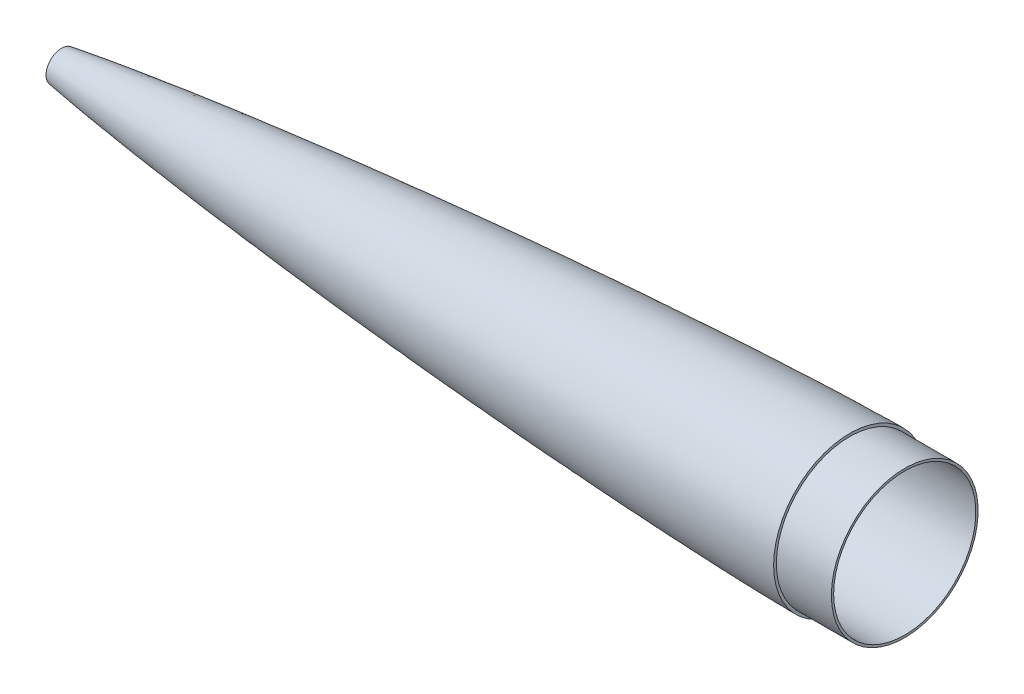
ISO-10303-21;
HEADER;
FILE_DESCRIPTION(('STEP AP214'),'2;1');
FILE_NAME('part.step','',(''),(''),'','','');
FILE_SCHEMA(('AUTOMOTIVE_DESIGN { 1 0 10303 214 1 1 1 1 }'));
ENDSEC;
DATA;
#1=APPLICATION_CONTEXT('core data for automotive mechanical design processes');
#2=APPLICATION_PROTOCOL_DEFINITION('international standard','automotive_design',2000,#1);
#3=PRODUCT_CONTEXT('',#1,'mechanical');
#4=PRODUCT('Part','Part','',(#3));
#5=PRODUCT_RELATED_PRODUCT_CATEGORY('part','',(#4));
#6=PRODUCT_DEFINITION_FORMATION('','',#4);
#7=PRODUCT_DEFINITION_CONTEXT('part definition',#1,'design');
#8=PRODUCT_DEFINITION('design','',#6,#7);
#9=PRODUCT_DEFINITION_SHAPE('','',#8);
#10=(LENGTH_UNIT() NAMED_UNIT(*) SI_UNIT(.MILLI.,.METRE.));
#11=(NAMED_UNIT(*) PLANE_ANGLE_UNIT() SI_UNIT($,.RADIAN.));
#12=(NAMED_UNIT(*) SI_UNIT($,.STERADIAN.) SOLID_ANGLE_UNIT());
#13=UNCERTAINTY_MEASURE_WITH_UNIT(LENGTH_MEASURE(1.E-05),#10,'distance_accuracy_value','');
#14=(GEOMETRIC_REPRESENTATION_CONTEXT(3) GLOBAL_UNCERTAINTY_ASSIGNED_CONTEXT((#13)) GLOBAL_UNIT_ASSIGNED_CONTEXT((#10,
#11,#12)) REPRESENTATION_CONTEXT('',''));
#15=CARTESIAN_POINT('',(0.,0.,0.));
#16=DIRECTION('',(0.,0.,1.));
#17=DIRECTION('',(1.,0.,0.));
#18=AXIS2_PLACEMENT_3D('',#15,#16,#17);
#19=CARTESIAN_POINT('',(596.9,52.74818,0.));
#20=CARTESIAN_POINT('',(594.981085772942,52.7439766182815,0.));
#21=CARTESIAN_POINT('',(591.143361642924,52.7119561177822,0.));
#22=CARTESIAN_POINT('',(583.468325071776,52.6115940478195,0.));
#23=CARTESIAN_POINT('',(571.206307330957,52.3702922496184,0.));
#24=CARTESIAN_POINT('',(556.277134536275,51.9856247831863,0.));
#25=CARTESIAN_POINT('',(534.095751609961,51.2822622218943,0.));
#26=CARTESIAN_POINT('',(506.5841207546,50.2205319325961,0.));
#27=CARTESIAN_POINT('',(474.496680759096,48.7563639094325,0.));
#28=CARTESIAN_POINT('',(437.838411885817,46.818732197122,0.));
#29=CARTESIAN_POINT('',(401.193599470544,44.6420572267023,0.));
#30=CARTESIAN_POINT('',(364.562894607915,42.2399567576188,0.));
#31=CARTESIAN_POINT('',(327.947239610889,39.618425854242,0.));
#32=CARTESIAN_POINT('',(291.348007401785,36.7768124514222,0.));
#33=CARTESIAN_POINT('',(254.767048184149,33.7085063186159,0.));
#34=CARTESIAN_POINT('',(218.207080059752,30.3992455850085,0.));
#35=CARTESIAN_POINT('',(181.67186265107,26.8260098654848,0.));
#36=CARTESIAN_POINT('',(145.167419267207,22.9502479118758,0.));
#37=CARTESIAN_POINT('',(108.703042074813,18.711081158448,0.));
#38=CARTESIAN_POINT('',(75.561592020845,14.4184193653755,0.));
#39=CARTESIAN_POINT('',(48.0380921073077,10.3790406790519,0.));
#40=CARTESIAN_POINT('',(27.782103231772,6.92717758336565,0.));
#41=CARTESIAN_POINT('',(15.6155281201881,4.51233854333897,0.));
#42=CARTESIAN_POINT('',(8.71933118048638,2.91617819387342,0.));
#43=CARTESIAN_POINT('',(5.02966537861984,1.92884340558088,0.));
#44=CARTESIAN_POINT('',(3.02858814726836,1.31676153051974,0.));
#45=CARTESIAN_POINT('',(1.91317692998907,0.93176035109636,0.));
#46=CARTESIAN_POINT('',(1.29300271208459,0.693253150144167,0.));
#47=CARTESIAN_POINT('',(0.932165851339865,0.541497874129996,0.));
#48=CARTESIAN_POINT('',(0.699728382330023,0.436250009913596,0.));
#49=CARTESIAN_POINT('',(0.539072772842008,0.359186242832004,0.));
#50=CARTESIAN_POINT('',(0.399119277455206,0.287038857933432,0.));
#51=CARTESIAN_POINT('',(0.279818282563663,0.220197585336474,0.));
#52=CARTESIAN_POINT('',(0.180428525159842,0.158737146182066,0.));
#53=CARTESIAN_POINT('',(0.110473241421188,0.110595859922417,0.));
#54=CARTESIAN_POINT('',(0.0582878402621543,0.0690247542532056,0.));
#55=CARTESIAN_POINT('',(0.023331290383149,0.0352525733814115,0.));
#56=CARTESIAN_POINT('',(0.00804574966633972,0.0163261743468633,0.));
#57=CARTESIAN_POINT('',(0.00237693213132801,0.00563433549737124,0.));
#58=CARTESIAN_POINT('',(0.,0.,0.));
#59=B_SPLINE_CURVE_WITH_KNOTS('',4,(#19,#20,#21,#22,#23,#24,#25,#26,#27,#28,#29,#30,#31,#32,#33,
#34,#35,#36,#37,#38,#39,#40,#41,#42,#43,#44,#45,#46,#47,#48,#49,#50,#51,#52,#53,#54,#55,#56,#57,
#58),.UNSPECIFIED.,.F.,.F.,(5,1,1,1,1,1,1,1,1,1,1,1,1,1,1,1,1,1,1,1,1,1,1,1,1,1,1,1,1,1,1,1,1,1,
1,1,5),(0.,0.0127915006460431,0.0255830012920861,0.0511660025841724,0.0817539552175705,
0.112341907850969,0.173517813554601,0.234693719179658,0.295869624144422,0.357045529383124,
0.418221434840136,0.479397340471153,0.54057324623338,0.601749151591606,0.662925056674679,
0.724100961894715,0.785276867533579,0.846452772012617,0.907628670550915,0.946859777235718,
0.970700652554181,0.983412262477229,0.990301731317356,0.994037247427691,0.996156512029755,
0.997358787258242,0.99816596334814,0.998465742833605,0.99876552231907,0.99905955597412,
0.99935358962917,0.999515192221878,0.999676794814585,0.999838397407293,0.999919198703646,
0.999959599351823,1.),.UNSPECIFIED.);
#60=CARTESIAN_POINT('',(0.,0.,0.));
#61=DIRECTION('',(-1.,0.,0.));
#62=AXIS1_PLACEMENT('',#60,#61);
#63=SURFACE_OF_REVOLUTION('',#59,#62);
#64=CARTESIAN_POINT('',(50.8000000000001,0.,0.));
#65=DIRECTION('',(-1.,0.,0.));
#66=DIRECTION('',(0.,0.,1.));
#67=AXIS2_PLACEMENT_3D('',#64,#65,#66);
#68=CIRCLE('',#67,10.6878333302251);
#69=CARTESIAN_POINT('',(50.8000000000001,0.,10.6878333302251));
#70=VERTEX_POINT('',#69);
#71=EDGE_CURVE('E95',#70,#70,#68,.F.);
#72=ORIENTED_EDGE('',*,*,#71,.T.);
#73=EDGE_LOOP('',(#72));
#74=FACE_BOUND('',#73,.T.);
#75=CARTESIAN_POINT('',(596.9,0.,0.));
#76=DIRECTION('',(-1.,0.,0.));
#77=DIRECTION('',(0.,0.,1.));
#78=AXIS2_PLACEMENT_3D('',#75,#76,#77);
#79=CIRCLE('',#78,52.74818);
#80=CARTESIAN_POINT('',(596.9,0.,52.74818));
#81=VERTEX_POINT('',#80);
#82=EDGE_CURVE('E10',#81,#81,#79,.T.);
#83=ORIENTED_EDGE('',*,*,#82,.T.);
#84=EDGE_LOOP('',(#83));
#85=FACE_BOUND('',#84,.T.);
#86=ADVANCED_FACE('F34',(#74,#85),#63,.T.);
#87=CARTESIAN_POINT('',(596.9,0.,0.));
#88=DIRECTION('',(-1.,0.,0.));
#89=DIRECTION('',(0.,0.,1.));
#90=AXIS2_PLACEMENT_3D('',#87,#88,#89);
#91=PLANE('',#90);
#92=CARTESIAN_POINT('',(596.9,0.,0.));
#93=DIRECTION('',(-1.,0.,0.));
#94=DIRECTION('',(0.,0.,1.));
#95=AXIS2_PLACEMENT_3D('',#92,#93,#94);
#96=CIRCLE('',#95,50.8380953963041);
#97=CARTESIAN_POINT('',(596.9,0.,50.8380953963041));
#98=VERTEX_POINT('',#97);
#99=EDGE_CURVE('E42',#98,#98,#96,.F.);
#100=ORIENTED_EDGE('',*,*,#99,.F.);
#101=EDGE_LOOP('',(#100));
#102=FACE_BOUND('',#101,.T.);
#103=ORIENTED_EDGE('',*,*,#82,.F.);
#104=EDGE_LOOP('',(#103));
#105=FACE_BOUND('',#104,.T.);
#106=ADVANCED_FACE('F77',(#102,#105),#91,.F.);
#107=CARTESIAN_POINT('',(635.,0.,0.));
#108=DIRECTION('',(-1.,0.,0.));
#109=DIRECTION('',(0.,0.,1.));
#110=AXIS2_PLACEMENT_3D('',#107,#108,#109);
#111=CYLINDRICAL_SURFACE('',#110,50.8380953963041);
#112=CARTESIAN_POINT('',(635.,0.,0.));
#113=DIRECTION('',(1.,0.,0.));
#114=DIRECTION('',(0.,0.,-1.));
#115=AXIS2_PLACEMENT_3D('',#112,#113,#114);
#116=CIRCLE('',#115,50.8380953963041);
#117=CARTESIAN_POINT('',(635.,0.,50.8380953963041));
#118=VERTEX_POINT('',#117);
#119=EDGE_CURVE('E54',#118,#118,#116,.T.);
#120=CARTESIAN_POINT('',(635.,0.,50.8380953963041));
#121=CARTESIAN_POINT('',(634.603125,0.,50.8380953963041));
#122=CARTESIAN_POINT('',(634.20625,0.,50.8380953963041));
#123=CARTESIAN_POINT('',(633.4125,0.,50.8380953963041));
#124=CARTESIAN_POINT('',(633.015625,0.,50.8380953963041));
#125=CARTESIAN_POINT('',(632.221875,0.,50.8380953963041));
#126=CARTESIAN_POINT('',(631.825,0.,50.8380953963041));
#127=CARTESIAN_POINT('',(631.03125,0.,50.8380953963041));
#128=CARTESIAN_POINT('',(630.634375,0.,50.8380953963041));
#129=CARTESIAN_POINT('',(629.840625,0.,50.8380953963041));
#130=CARTESIAN_POINT('',(629.44375,0.,50.8380953963041));
#131=CARTESIAN_POINT('',(628.65,0.,50.8380953963041));
#132=CARTESIAN_POINT('',(628.253125,0.,50.8380953963041));
#133=CARTESIAN_POINT('',(627.459375,0.,50.8380953963041));
#134=CARTESIAN_POINT('',(627.0625,0.,50.8380953963041));
#135=CARTESIAN_POINT('',(626.26875,0.,50.8380953963041));
#136=CARTESIAN_POINT('',(625.871875,0.,50.8380953963041));
#137=CARTESIAN_POINT('',(625.078125,0.,50.8380953963041));
#138=CARTESIAN_POINT('',(624.68125,0.,50.8380953963041));
#139=CARTESIAN_POINT('',(623.8875,0.,50.8380953963041));
#140=CARTESIAN_POINT('',(623.490625,0.,50.8380953963041));
#141=CARTESIAN_POINT('',(622.696875,0.,50.8380953963041));
#142=CARTESIAN_POINT('',(622.3,0.,50.8380953963041));
#143=CARTESIAN_POINT('',(621.50625,0.,50.8380953963041));
#144=CARTESIAN_POINT('',(621.109375,0.,50.8380953963041));
#145=CARTESIAN_POINT('',(620.315625,0.,50.8380953963041));
#146=CARTESIAN_POINT('',(619.91875,0.,50.8380953963041));
#147=CARTESIAN_POINT('',(619.125,0.,50.8380953963041));
#148=CARTESIAN_POINT('',(618.728125,0.,50.8380953963041));
#149=CARTESIAN_POINT('',(617.934375,0.,50.8380953963041));
#150=CARTESIAN_POINT('',(617.5375,0.,50.8380953963041));
#151=CARTESIAN_POINT('',(616.74375,0.,50.8380953963041));
#152=CARTESIAN_POINT('',(616.346875,0.,50.8380953963041));
#153=CARTESIAN_POINT('',(615.553125,0.,50.8380953963041));
#154=CARTESIAN_POINT('',(615.15625,0.,50.8380953963041));
#155=CARTESIAN_POINT('',(614.3625,0.,50.8380953963041));
#156=CARTESIAN_POINT('',(613.965625,0.,50.8380953963041));
#157=CARTESIAN_POINT('',(613.171875,0.,50.8380953963041));
#158=CARTESIAN_POINT('',(612.775,0.,50.8380953963041));
#159=CARTESIAN_POINT('',(611.98125,0.,50.8380953963041));
#160=CARTESIAN_POINT('',(611.584375,0.,50.8380953963041));
#161=CARTESIAN_POINT('',(610.790625,0.,50.8380953963041));
#162=CARTESIAN_POINT('',(610.39375,0.,50.8380953963041));
#163=CARTESIAN_POINT('',(609.6,0.,50.8380953963041));
#164=CARTESIAN_POINT('',(609.203125,0.,50.8380953963041));
#165=CARTESIAN_POINT('',(608.409375,0.,50.8380953963041));
#166=CARTESIAN_POINT('',(608.0125,0.,50.8380953963041));
#167=CARTESIAN_POINT('',(607.21875,0.,50.8380953963041));
#168=CARTESIAN_POINT('',(606.821875,0.,50.8380953963041));
#169=CARTESIAN_POINT('',(606.028125,0.,50.8380953963041));
#170=CARTESIAN_POINT('',(605.63125,0.,50.8380953963041));
#171=CARTESIAN_POINT('',(604.8375,0.,50.8380953963041));
#172=CARTESIAN_POINT('',(604.440625,0.,50.8380953963041));
#173=CARTESIAN_POINT('',(603.646875,0.,50.8380953963041));
#174=CARTESIAN_POINT('',(603.25,0.,50.8380953963041));
#175=CARTESIAN_POINT('',(602.45625,0.,50.8380953963041));
#176=CARTESIAN_POINT('',(602.059375,0.,50.8380953963041));
#177=CARTESIAN_POINT('',(601.265625,0.,50.8380953963041));
#178=CARTESIAN_POINT('',(600.86875,0.,50.8380953963041));
#179=CARTESIAN_POINT('',(600.075,0.,50.8380953963041));
#180=CARTESIAN_POINT('',(599.678125,0.,50.8380953963041));
#181=CARTESIAN_POINT('',(598.884375,0.,50.8380953963041));
#182=CARTESIAN_POINT('',(598.4875,0.,50.8380953963041));
#183=CARTESIAN_POINT('',(597.69375,0.,50.8380953963041));
#184=CARTESIAN_POINT('',(597.296875,0.,50.8380953963041));
#185=CARTESIAN_POINT('',(596.9,0.,50.8380953963041));
#186=B_SPLINE_CURVE_WITH_KNOTS('',3,(#120,#121,#122,#123,#124,#125,#126,#127,#128,#129,#130,
#131,#132,#133,#134,#135,#136,#137,#138,#139,#140,#141,#142,#143,#144,#145,#146,#147,#148,#149,
#150,#151,#152,#153,#154,#155,#156,#157,#158,#159,#160,#161,#162,#163,#164,#165,#166,#167,#168,
#169,#170,#171,#172,#173,#174,#175,#176,#177,#178,#179,#180,#181,#182,#183,#184,#185),
.UNSPECIFIED.,.F.,.F.,(4,2,2,2,2,2,2,2,2,2,2,2,2,2,2,2,2,2,2,2,2,2,2,2,2,2,2,2,2,2,2,2,4),(0.,
1.19062499999989,2.38124999999989,3.57187499999989,4.76249999999989,5.95312499999989,
7.14374999999989,8.33437499999989,9.5249999999999,10.7156249999999,11.9062499999999,
13.0968749999999,14.2874999999999,15.4781249999999,16.6687499999999,17.8593749999999,
19.0499999999999,20.2406249999999,21.4312499999999,22.6218749999999,23.8124999999999,
25.0031249999999,26.1937499999999,27.3843749999999,28.5749999999999,29.7656249999999,
30.9562499999999,32.1468749999999,33.3374999999999,34.5281249999999,35.7187499999999,
36.9093749999998,38.0999999999998),.UNSPECIFIED.);
#187=EDGE_CURVE('BSEAM79',#118,#98,#186,.T.);
#188=ORIENTED_EDGE('',*,*,#119,.F.);
#189=ORIENTED_EDGE('',*,*,#99,.T.);
#190=ORIENTED_EDGE('',*,*,#187,.T.);
#191=ORIENTED_EDGE('',*,*,#187,.F.);
#192=EDGE_LOOP('',(#188,#190,#189,#191));
#193=FACE_BOUND('',#192,.T.);
#194=ADVANCED_FACE('F79',(#193),#111,.T.);
#195=CARTESIAN_POINT('',(558.8,0.,0.));
#196=DIRECTION('',(1.,0.,0.));
#197=DIRECTION('',(0.,0.,-1.));
#198=AXIS2_PLACEMENT_3D('',#195,#196,#197);
#199=PLANE('',#198);
#200=CARTESIAN_POINT('',(558.8,0.,0.));
#201=DIRECTION('',(1.,0.,0.));
#202=DIRECTION('',(0.,0.,-1.));
#203=AXIS2_PLACEMENT_3D('',#200,#201,#202);
#204=CIRCLE('',#203,49.2505953963041);
#205=CARTESIAN_POINT('',(558.8,0.,49.2505953963041));
#206=VERTEX_POINT('',#205);
#207=EDGE_CURVE('E63',#206,#206,#204,.T.);
#208=ORIENTED_EDGE('',*,*,#207,.T.);
#209=EDGE_LOOP('',(#208));
#210=FACE_BOUND('',#209,.T.);
#211=CARTESIAN_POINT('',(558.8,0.,0.));
#212=DIRECTION('',(-1.,0.,0.));
#213=DIRECTION('',(0.,0.,1.));
#214=AXIS2_PLACEMENT_3D('',#211,#212,#213);
#215=CIRCLE('',#214,50.1244954155033);
#216=CARTESIAN_POINT('',(558.8,0.,50.1244954155033));
#217=VERTEX_POINT('',#216);
#218=EDGE_CURVE('E47',#217,#217,#215,.F.);
#219=ORIENTED_EDGE('',*,*,#218,.F.);
#220=EDGE_LOOP('',(#219));
#221=FACE_BOUND('',#220,.T.);
#222=ADVANCED_FACE('F85',(#210,#221),#199,.F.);
#223=CARTESIAN_POINT('',(635.,0.,0.));
#224=DIRECTION('',(1.,0.,0.));
#225=DIRECTION('',(0.,0.,-1.));
#226=AXIS2_PLACEMENT_3D('',#223,#224,#225);
#227=PLANE('',#226);
#228=ORIENTED_EDGE('',*,*,#119,.T.);
#229=EDGE_LOOP('',(#228));
#230=FACE_BOUND('',#229,.T.);
#231=CARTESIAN_POINT('',(635.,0.,0.));
#232=DIRECTION('',(1.,0.,0.));
#233=DIRECTION('',(0.,0.,-1.));
#234=AXIS2_PLACEMENT_3D('',#231,#232,#233);
#235=CIRCLE('',#234,49.2505953963041);
#236=CARTESIAN_POINT('',(635.,0.,49.2505953963041));
#237=VERTEX_POINT('',#236);
#238=EDGE_CURVE('E58',#237,#237,#235,.T.);
#239=ORIENTED_EDGE('',*,*,#238,.F.);
#240=EDGE_LOOP('',(#239));
#241=FACE_BOUND('',#240,.T.);
#242=ADVANCED_FACE('F111',(#230,#241),#227,.T.);
#243=CARTESIAN_POINT('',(635.,0.,0.));
#244=DIRECTION('',(-1.,0.,0.));
#245=DIRECTION('',(0.,0.,1.));
#246=AXIS2_PLACEMENT_3D('',#243,#244,#245);
#247=CYLINDRICAL_SURFACE('',#246,49.2505953963041);
#248=CARTESIAN_POINT('',(635.,0.,49.2505953963041));
#249=CARTESIAN_POINT('',(634.20625,0.,49.2505953963041));
#250=CARTESIAN_POINT('',(633.4125,0.,49.2505953963041));
#251=CARTESIAN_POINT('',(631.825,0.,49.2505953963041));
#252=CARTESIAN_POINT('',(631.03125,0.,49.2505953963041));
#253=CARTESIAN_POINT('',(629.44375,0.,49.2505953963041));
#254=CARTESIAN_POINT('',(628.65,0.,49.2505953963041));
#255=CARTESIAN_POINT('',(627.0625,0.,49.2505953963041));
#256=CARTESIAN_POINT('',(626.26875,0.,49.2505953963041));
#257=CARTESIAN_POINT('',(624.68125,0.,49.2505953963041));
#258=CARTESIAN_POINT('',(623.8875,0.,49.2505953963041));
#259=CARTESIAN_POINT('',(622.3,0.,49.2505953963041));
#260=CARTESIAN_POINT('',(621.50625,0.,49.2505953963041));
#261=CARTESIAN_POINT('',(619.91875,0.,49.2505953963041));
#262=CARTESIAN_POINT('',(619.125,0.,49.2505953963041));
#263=CARTESIAN_POINT('',(617.5375,0.,49.2505953963041));
#264=CARTESIAN_POINT('',(616.74375,0.,49.2505953963041));
#265=CARTESIAN_POINT('',(615.15625,0.,49.2505953963041));
#266=CARTESIAN_POINT('',(614.3625,0.,49.2505953963041));
#267=CARTESIAN_POINT('',(612.775,0.,49.2505953963041));
#268=CARTESIAN_POINT('',(611.98125,0.,49.2505953963041));
#269=CARTESIAN_POINT('',(610.39375,0.,49.2505953963041));
#270=CARTESIAN_POINT('',(609.6,0.,49.2505953963041));
#271=CARTESIAN_POINT('',(608.0125,0.,49.2505953963041));
#272=CARTESIAN_POINT('',(607.21875,0.,49.2505953963041));
#273=CARTESIAN_POINT('',(605.63125,0.,49.2505953963041));
#274=CARTESIAN_POINT('',(604.8375,0.,49.2505953963041));
#275=CARTESIAN_POINT('',(603.25,0.,49.2505953963041));
#276=CARTESIAN_POINT('',(602.45625,0.,49.2505953963041));
#277=CARTESIAN_POINT('',(600.86875,0.,49.2505953963041));
#278=CARTESIAN_POINT('',(600.075,0.,49.2505953963041));
#279=CARTESIAN_POINT('',(598.4875,0.,49.2505953963041));
#280=CARTESIAN_POINT('',(597.69375,0.,49.2505953963041));
#281=CARTESIAN_POINT('',(596.10625,0.,49.2505953963041));
#282=CARTESIAN_POINT('',(595.3125,0.,49.2505953963041));
#283=CARTESIAN_POINT('',(593.725,0.,49.2505953963041));
#284=CARTESIAN_POINT('',(592.93125,0.,49.2505953963041));
#285=CARTESIAN_POINT('',(591.34375,0.,49.2505953963041));
#286=CARTESIAN_POINT('',(590.55,0.,49.2505953963041));
#287=CARTESIAN_POINT('',(588.9625,0.,49.2505953963041));
#288=CARTESIAN_POINT('',(588.16875,0.,49.2505953963041));
#289=CARTESIAN_POINT('',(586.58125,0.,49.2505953963041));
#290=CARTESIAN_POINT('',(585.7875,0.,49.2505953963041));
#291=CARTESIAN_POINT('',(584.2,0.,49.2505953963041));
#292=CARTESIAN_POINT('',(583.40625,0.,49.2505953963041));
#293=CARTESIAN_POINT('',(581.81875,0.,49.2505953963041));
#294=CARTESIAN_POINT('',(581.025,0.,49.2505953963041));
#295=CARTESIAN_POINT('',(579.4375,0.,49.2505953963041));
#296=CARTESIAN_POINT('',(578.64375,0.,49.2505953963041));
#297=CARTESIAN_POINT('',(577.05625,0.,49.2505953963041));
#298=CARTESIAN_POINT('',(576.2625,0.,49.2505953963041));
#299=CARTESIAN_POINT('',(574.675,0.,49.2505953963041));
#300=CARTESIAN_POINT('',(573.88125,0.,49.2505953963041));
#301=CARTESIAN_POINT('',(572.29375,0.,49.2505953963041));
#302=CARTESIAN_POINT('',(571.5,0.,49.2505953963041));
#303=CARTESIAN_POINT('',(569.9125,0.,49.2505953963041));
#304=CARTESIAN_POINT('',(569.11875,0.,49.2505953963041));
#305=CARTESIAN_POINT('',(567.53125,0.,49.2505953963041));
#306=CARTESIAN_POINT('',(566.7375,0.,49.2505953963041));
#307=CARTESIAN_POINT('',(565.15,0.,49.2505953963041));
#308=CARTESIAN_POINT('',(564.35625,0.,49.2505953963041));
#309=CARTESIAN_POINT('',(562.76875,0.,49.2505953963041));
#310=CARTESIAN_POINT('',(561.975,0.,49.2505953963041));
#311=CARTESIAN_POINT('',(560.3875,0.,49.2505953963041));
#312=CARTESIAN_POINT('',(559.59375,0.,49.2505953963041));
#313=CARTESIAN_POINT('',(558.8,0.,49.2505953963041));
#314=B_SPLINE_CURVE_WITH_KNOTS('',3,(#248,#249,#250,#251,#252,#253,#254,#255,#256,#257,#258,
#259,#260,#261,#262,#263,#264,#265,#266,#267,#268,#269,#270,#271,#272,#273,#274,#275,#276,#277,
#278,#279,#280,#281,#282,#283,#284,#285,#286,#287,#288,#289,#290,#291,#292,#293,#294,#295,#296,
#297,#298,#299,#300,#301,#302,#303,#304,#305,#306,#307,#308,#309,#310,#311,#312,#313),
.UNSPECIFIED.,.F.,.F.,(4,2,2,2,2,2,2,2,2,2,2,2,2,2,2,2,2,2,2,2,2,2,2,2,2,2,2,2,2,2,2,2,4),(0.,
2.38125,4.7625,7.14375,9.52500000000001,11.90625,14.2875,16.66875,19.05,21.43125,23.8125,
26.19375,28.575,30.95625,33.3375,35.71875,38.1,40.48125,42.8625,45.24375,47.625,50.00625,
52.3875,54.76875,57.15,59.53125,61.9125,64.29375,66.675,69.05625,71.4375,73.8187500000001,76.2),.UNSPECIFIED.);
#315=EDGE_CURVE('BSEAM105',#237,#206,#314,.T.);
#316=ORIENTED_EDGE('',*,*,#238,.T.);
#317=ORIENTED_EDGE('',*,*,#207,.F.);
#318=ORIENTED_EDGE('',*,*,#315,.T.);
#319=ORIENTED_EDGE('',*,*,#315,.F.);
#320=EDGE_LOOP('',(#316,#318,#317,#319));
#321=FACE_BOUND('',#320,.T.);
#322=ADVANCED_FACE('F105',(#321),#247,.F.);
#323=CARTESIAN_POINT('',(596.9,52.74818,0.));
#324=CARTESIAN_POINT('',(594.981085772942,52.7439766182815,0.));
#325=CARTESIAN_POINT('',(591.143361642924,52.7119561177822,0.));
#326=CARTESIAN_POINT('',(583.468325071776,52.6115940478195,0.));
#327=CARTESIAN_POINT('',(571.206307330957,52.3702922496184,0.));
#328=CARTESIAN_POINT('',(556.277134536275,51.9856247831863,0.));
#329=CARTESIAN_POINT('',(534.095751609961,51.2822622218943,0.));
#330=CARTESIAN_POINT('',(506.5841207546,50.2205319325961,0.));
#331=CARTESIAN_POINT('',(474.496680759096,48.7563639094325,0.));
#332=CARTESIAN_POINT('',(437.838411885817,46.818732197122,0.));
#333=CARTESIAN_POINT('',(401.193599470544,44.6420572267023,0.));
#334=CARTESIAN_POINT('',(364.562894607915,42.2399567576188,0.));
#335=CARTESIAN_POINT('',(327.947239610889,39.618425854242,0.));
#336=CARTESIAN_POINT('',(291.348007401785,36.7768124514222,0.));
#337=CARTESIAN_POINT('',(254.767048184149,33.7085063186159,0.));
#338=CARTESIAN_POINT('',(218.207080059752,30.3992455850085,0.));
#339=CARTESIAN_POINT('',(181.67186265107,26.8260098654848,0.));
#340=CARTESIAN_POINT('',(145.167419267207,22.9502479118758,0.));
#341=CARTESIAN_POINT('',(108.703042074813,18.711081158448,0.));
#342=CARTESIAN_POINT('',(75.561592020845,14.4184193653755,0.));
#343=CARTESIAN_POINT('',(48.0380921073077,10.3790406790519,0.));
#344=CARTESIAN_POINT('',(27.782103231772,6.92717758336565,0.));
#345=CARTESIAN_POINT('',(15.6155281201881,4.51233854333897,0.));
#346=CARTESIAN_POINT('',(9.10026394578531,3.00434704709772,0.));
#347=CARTESIAN_POINT('',(6.09264242860423,2.21175303915275,0.));
#348=CARTESIAN_POINT('',(4.93563552969569,1.88238723916885,0.));
#349=CARTESIAN_POINT('',(4.77280588160991,1.8355007837493,0.));
#350=B_SPLINE_CURVE_WITH_KNOTS('',4,(#323,#324,#325,#326,#327,#328,#329,#330,#331,#332,#333,
#334,#335,#336,#337,#338,#339,#340,#341,#342,#343,#344,#345,#346,#347,#348,#349),.UNSPECIFIED.,
.F.,.F.,(5,1,1,1,1,1,1,1,1,1,1,1,1,1,1,1,1,1,1,1,1,1,1,5),(0.,0.0127915006460431,
0.0255830012920861,0.0511660025841724,0.0817539552175705,0.112341907850969,0.173517813554601,
0.234693719179658,0.295869624144422,0.357045529383124,0.418221434840136,0.479397340471153,
0.54057324623338,0.601749151591606,0.662925056674679,0.724100961894715,0.785276867533579,
0.846452772012617,0.907628670550915,0.946859777235718,0.970700652554181,0.983412262477229,
0.990301731317356,0.991431253959526),.UNSPECIFIED.);
#351=CARTESIAN_POINT('',(0.,0.,0.));
#352=DIRECTION('',(-1.,0.,0.));
#353=AXIS1_PLACEMENT('',#351,#352);
#354=SURFACE_OF_REVOLUTION('',#350,#353);
#355=OFFSET_SURFACE('',#354,-1.91008,.F.);
#356=CARTESIAN_POINT('',(50.7999999999999,0.,0.));
#357=DIRECTION('',(-1.,0.,0.));
#358=DIRECTION('',(0.,0.,1.));
#359=AXIS2_PLACEMENT_3D('',#356,#357,#358);
#360=CIRCLE('',#359,8.75491993087911);
#361=CARTESIAN_POINT('',(50.7999999999999,0.,8.75491993087911));
#362=VERTEX_POINT('',#361);
#363=EDGE_CURVE('E38',#362,#362,#360,.F.);
#364=ORIENTED_EDGE('',*,*,#363,.F.);
#365=EDGE_LOOP('',(#364));
#366=FACE_BOUND('',#365,.T.);
#367=ORIENTED_EDGE('',*,*,#218,.T.);
#368=EDGE_LOOP('',(#367));
#369=FACE_BOUND('',#368,.T.);
#370=ADVANCED_FACE('F75',(#366,#369),#355,.F.);
#371=CARTESIAN_POINT('',(50.8,0.,0.));
#372=DIRECTION('',(1.,0.,0.));
#373=DIRECTION('',(0.,0.,-1.));
#374=AXIS2_PLACEMENT_3D('',#371,#372,#373);
#375=PLANE('',#374);
#376=ORIENTED_EDGE('',*,*,#363,.T.);
#377=EDGE_LOOP('',(#376));
#378=FACE_BOUND('',#377,.T.);
#379=ORIENTED_EDGE('',*,*,#71,.F.);
#380=EDGE_LOOP('',(#379));
#381=FACE_BOUND('',#380,.T.);
#382=ADVANCED_FACE('F102',(#378,#381),#375,.F.);
#383=CLOSED_SHELL('',(#86,#106,#194,#222,#242,#322,#370,#382));
#384=MANIFOLD_SOLID_BREP('B2',#383);
#385=ADVANCED_BREP_SHAPE_REPRESENTATION('',(#18,#384),#14);
#386=SHAPE_DEFINITION_REPRESENTATION(#9,#385);
ENDSEC;
END-ISO-10303-21;
